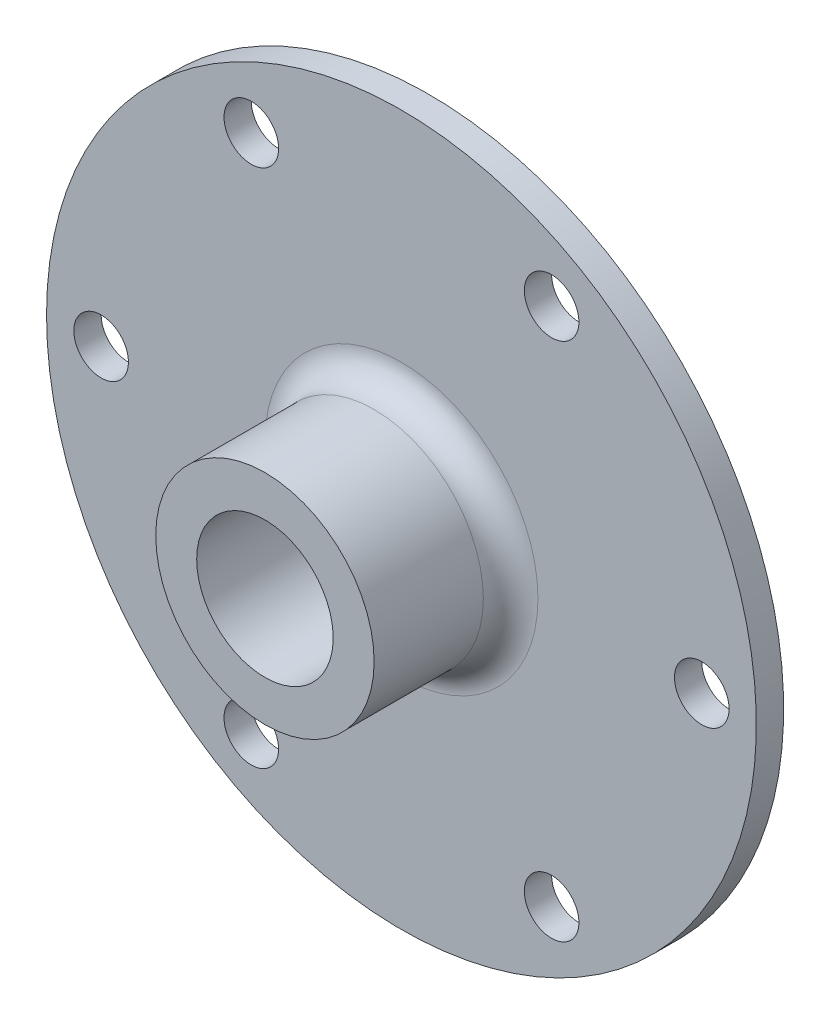
ISO-10303-21;
HEADER;
FILE_DESCRIPTION(('STEP AP214'),'2;1');
FILE_NAME('part.step','',(''),(''),'','','');
FILE_SCHEMA(('AUTOMOTIVE_DESIGN { 1 0 10303 214 1 1 1 1 }'));
ENDSEC;
DATA;
#1=APPLICATION_CONTEXT('core data for automotive mechanical design processes');
#2=APPLICATION_PROTOCOL_DEFINITION('international standard','automotive_design',2000,#1);
#3=PRODUCT_CONTEXT('',#1,'mechanical');
#4=PRODUCT('Part','Part','',(#3));
#5=PRODUCT_RELATED_PRODUCT_CATEGORY('part','',(#4));
#6=PRODUCT_DEFINITION_FORMATION('','',#4);
#7=PRODUCT_DEFINITION_CONTEXT('part definition',#1,'design');
#8=PRODUCT_DEFINITION('design','',#6,#7);
#9=PRODUCT_DEFINITION_SHAPE('','',#8);
#10=(LENGTH_UNIT() NAMED_UNIT(*) SI_UNIT(.MILLI.,.METRE.));
#11=(NAMED_UNIT(*) PLANE_ANGLE_UNIT() SI_UNIT($,.RADIAN.));
#12=(NAMED_UNIT(*) SI_UNIT($,.STERADIAN.) SOLID_ANGLE_UNIT());
#13=UNCERTAINTY_MEASURE_WITH_UNIT(LENGTH_MEASURE(1.E-05),#10,'distance_accuracy_value','');
#14=(GEOMETRIC_REPRESENTATION_CONTEXT(3) GLOBAL_UNCERTAINTY_ASSIGNED_CONTEXT((#13)) GLOBAL_UNIT_ASSIGNED_CONTEXT((#10,
#11,#12)) REPRESENTATION_CONTEXT('',''));
#15=CARTESIAN_POINT('',(0.,0.,0.));
#16=DIRECTION('',(0.,0.,1.));
#17=DIRECTION('',(1.,0.,0.));
#18=AXIS2_PLACEMENT_3D('',#15,#16,#17);
#19=CARTESIAN_POINT('',(0.,0.,1.92363442006733));
#20=DIRECTION('',(0.,0.,-1.));
#21=DIRECTION('',(-1.,0.,0.));
#22=AXIS2_PLACEMENT_3D('',#19,#20,#21);
#23=CYLINDRICAL_SURFACE('',#22,20.6375);
#24=CARTESIAN_POINT('',(0.,0.,3.51113442006734));
#25=DIRECTION('',(0.,0.,-1.));
#26=DIRECTION('',(-1.,0.,0.));
#27=AXIS2_PLACEMENT_3D('',#24,#25,#26);
#28=CIRCLE('',#27,20.6375);
#29=CARTESIAN_POINT('',(-20.6375,0.,3.51113442006734));
#30=VERTEX_POINT('',#29);
#31=EDGE_CURVE('E53',#30,#30,#28,.T.);
#32=ORIENTED_EDGE('',*,*,#31,.T.);
#33=EDGE_LOOP('',(#32));
#34=FACE_BOUND('',#33,.T.);
#35=CARTESIAN_POINT('',(0.,0.,1.92363442006733));
#36=DIRECTION('',(0.,0.,-1.));
#37=DIRECTION('',(-1.,0.,0.));
#38=AXIS2_PLACEMENT_3D('',#35,#36,#37);
#39=CIRCLE('',#38,20.6375);
#40=CARTESIAN_POINT('',(-20.6375,0.,1.92363442006733));
#41=VERTEX_POINT('',#40);
#42=EDGE_CURVE('E72',#41,#41,#39,.T.);
#43=ORIENTED_EDGE('',*,*,#42,.F.);
#44=EDGE_LOOP('',(#43));
#45=FACE_BOUND('',#44,.T.);
#46=ADVANCED_FACE('F40',(#34,#45),#23,.T.);
#47=CARTESIAN_POINT('',(0.,20.6375,3.51113442006734));
#48=DIRECTION('',(0.,0.,1.));
#49=DIRECTION('',(1.,0.,0.));
#50=AXIS2_PLACEMENT_3D('',#47,#48,#49);
#51=PLANE('',#50);
#52=CARTESIAN_POINT('',(8.73125000000018,15.1229686135857,3.51113442006734));
#53=DIRECTION('',(0.,0.,1.));
#54=DIRECTION('',(0.50000000000001,0.866025403784433,0.));
#55=AXIS2_PLACEMENT_3D('',#52,#53,#54);
#56=CIRCLE('',#55,1.5875);
#57=CARTESIAN_POINT('',(9.52500000000019,16.4977839420934,3.51113442006734));
#58=VERTEX_POINT('',#57);
#59=EDGE_CURVE('E116',#58,#58,#56,.T.);
#60=ORIENTED_EDGE('',*,*,#59,.F.);
#61=EDGE_LOOP('',(#60));
#62=FACE_BOUND('',#61,.T.);
#63=CARTESIAN_POINT('',(-8.73124999999986,15.1229686135858,3.51113442006734));
#64=DIRECTION('',(0.,0.,1.));
#65=DIRECTION('',(-0.499999999999992,0.866025403784443,0.));
#66=AXIS2_PLACEMENT_3D('',#63,#64,#65);
#67=CIRCLE('',#66,1.5875);
#68=CARTESIAN_POINT('',(-9.52499999999985,16.4977839420936,3.51113442006734));
#69=VERTEX_POINT('',#68);
#70=EDGE_CURVE('E108',#69,#69,#67,.T.);
#71=ORIENTED_EDGE('',*,*,#70,.F.);
#72=EDGE_LOOP('',(#71));
#73=FACE_BOUND('',#72,.T.);
#74=CARTESIAN_POINT('',(-17.4625,0.,3.51113442006734));
#75=DIRECTION('',(0.,0.,1.));
#76=DIRECTION('',(-1.,0.,0.));
#77=AXIS2_PLACEMENT_3D('',#74,#75,#76);
#78=CIRCLE('',#77,1.5875);
#79=CARTESIAN_POINT('',(-19.05,0.,3.51113442006734));
#80=VERTEX_POINT('',#79);
#81=EDGE_CURVE('E100',#80,#80,#78,.T.);
#82=ORIENTED_EDGE('',*,*,#81,.F.);
#83=EDGE_LOOP('',(#82));
#84=FACE_BOUND('',#83,.T.);
#85=CARTESIAN_POINT('',(-8.73125000000007,-15.1229686135857,3.51113442006734));
#86=DIRECTION('',(0.,0.,1.));
#87=DIRECTION('',(-0.500000000000004,-0.866025403784436,0.));
#88=AXIS2_PLACEMENT_3D('',#85,#86,#87);
#89=CIRCLE('',#88,1.5875);
#90=CARTESIAN_POINT('',(-9.52500000000008,-16.4977839420935,3.51113442006734));
#91=VERTEX_POINT('',#90);
#92=EDGE_CURVE('E92',#91,#91,#89,.T.);
#93=ORIENTED_EDGE('',*,*,#92,.F.);
#94=EDGE_LOOP('',(#93));
#95=FACE_BOUND('',#94,.T.);
#96=CARTESIAN_POINT('',(8.73124999999997,-15.1229686135858,3.51113442006734));
#97=DIRECTION('',(0.,0.,1.));
#98=DIRECTION('',(0.499999999999998,-0.86602540378444,0.));
#99=AXIS2_PLACEMENT_3D('',#96,#97,#98);
#100=CIRCLE('',#99,1.5875);
#101=CARTESIAN_POINT('',(9.52499999999996,-16.4977839420936,3.51113442006734));
#102=VERTEX_POINT('',#101);
#103=EDGE_CURVE('E81',#102,#102,#100,.T.);
#104=ORIENTED_EDGE('',*,*,#103,.F.);
#105=EDGE_LOOP('',(#104));
#106=FACE_BOUND('',#105,.T.);
#107=CARTESIAN_POINT('',(17.4625,0.,3.51113442006734));
#108=DIRECTION('',(0.,0.,1.));
#109=DIRECTION('',(1.,0.,0.));
#110=AXIS2_PLACEMENT_3D('',#107,#108,#109);
#111=CIRCLE('',#110,1.5875);
#112=CARTESIAN_POINT('',(19.05,0.,3.51113442006734));
#113=VERTEX_POINT('',#112);
#114=EDGE_CURVE('E77',#113,#113,#111,.T.);
#115=ORIENTED_EDGE('',*,*,#114,.F.);
#116=EDGE_LOOP('',(#115));
#117=FACE_BOUND('',#116,.T.);
#118=CARTESIAN_POINT('',(0.,0.,3.51113442006734));
#119=DIRECTION('',(0.,0.,1.));
#120=DIRECTION('',(1.,0.,0.));
#121=AXIS2_PLACEMENT_3D('',#118,#119,#120);
#122=CIRCLE('',#121,7.9375);
#123=CARTESIAN_POINT('',(7.9375,0.,3.51113442006734));
#124=VERTEX_POINT('',#123);
#125=EDGE_CURVE('E48',#124,#124,#122,.F.);
#126=ORIENTED_EDGE('',*,*,#125,.T.);
#127=EDGE_LOOP('',(#126));
#128=FACE_BOUND('',#127,.T.);
#129=ORIENTED_EDGE('',*,*,#31,.F.);
#130=EDGE_LOOP('',(#129));
#131=FACE_BOUND('',#130,.T.);
#132=ADVANCED_FACE('F135',(#62,#73,#84,#95,#106,#117,#128,#131),#51,.T.);
#133=CARTESIAN_POINT('',(0.,0.,1.92363442006733));
#134=DIRECTION('',(0.,0.,-1.));
#135=DIRECTION('',(-1.,0.,0.));
#136=AXIS2_PLACEMENT_3D('',#133,#134,#135);
#137=CYLINDRICAL_SURFACE('',#136,6.35);
#138=CARTESIAN_POINT('',(0.,0.,5.09863442006734));
#139=DIRECTION('',(0.,0.,1.));
#140=DIRECTION('',(1.,0.,0.));
#141=AXIS2_PLACEMENT_3D('',#138,#139,#140);
#142=CIRCLE('',#141,6.35);
#143=CARTESIAN_POINT('',(6.35,0.,5.09863442006734));
#144=VERTEX_POINT('',#143);
#145=EDGE_CURVE('E10',#144,#144,#142,.T.);
#146=ORIENTED_EDGE('',*,*,#145,.T.);
#147=EDGE_LOOP('',(#146));
#148=FACE_BOUND('',#147,.T.);
#149=CARTESIAN_POINT('',(0.,0.,11.4486344200673));
#150=DIRECTION('',(0.,0.,-1.));
#151=DIRECTION('',(-1.,0.,0.));
#152=AXIS2_PLACEMENT_3D('',#149,#150,#151);
#153=CIRCLE('',#152,6.35);
#154=CARTESIAN_POINT('',(-6.35,0.,11.4486344200673));
#155=VERTEX_POINT('',#154);
#156=EDGE_CURVE('E58',#155,#155,#153,.T.);
#157=ORIENTED_EDGE('',*,*,#156,.T.);
#158=EDGE_LOOP('',(#157));
#159=FACE_BOUND('',#158,.T.);
#160=ADVANCED_FACE('F138',(#148,#159),#137,.T.);
#161=CARTESIAN_POINT('',(0.,6.35,11.4486344200673));
#162=DIRECTION('',(0.,0.,1.));
#163=DIRECTION('',(1.,0.,0.));
#164=AXIS2_PLACEMENT_3D('',#161,#162,#163);
#165=PLANE('',#164);
#166=CARTESIAN_POINT('',(0.,0.,11.4486344200673));
#167=DIRECTION('',(0.,0.,-1.));
#168=DIRECTION('',(-1.,0.,0.));
#169=AXIS2_PLACEMENT_3D('',#166,#167,#168);
#170=CIRCLE('',#169,3.96875);
#171=CARTESIAN_POINT('',(-3.96875,0.,11.4486344200673));
#172=VERTEX_POINT('',#171);
#173=EDGE_CURVE('E64',#172,#172,#170,.T.);
#174=ORIENTED_EDGE('',*,*,#173,.T.);
#175=EDGE_LOOP('',(#174));
#176=FACE_BOUND('',#175,.T.);
#177=ORIENTED_EDGE('',*,*,#156,.F.);
#178=EDGE_LOOP('',(#177));
#179=FACE_BOUND('',#178,.T.);
#180=ADVANCED_FACE('F164',(#176,#179),#165,.T.);
#181=CARTESIAN_POINT('',(0.,0.,1.92363442006733));
#182=DIRECTION('',(0.,0.,-1.));
#183=DIRECTION('',(-1.,0.,0.));
#184=AXIS2_PLACEMENT_3D('',#181,#182,#183);
#185=CYLINDRICAL_SURFACE('',#184,3.96875);
#186=CARTESIAN_POINT('',(0.,0.,1.92363442006734));
#187=DIRECTION('',(0.,0.,-1.));
#188=DIRECTION('',(-1.,0.,0.));
#189=AXIS2_PLACEMENT_3D('',#186,#187,#188);
#190=CIRCLE('',#189,3.96875);
#191=CARTESIAN_POINT('',(-3.96875,0.,1.92363442006734));
#192=VERTEX_POINT('',#191);
#193=EDGE_CURVE('E68',#192,#192,#190,.T.);
#194=ORIENTED_EDGE('',*,*,#193,.T.);
#195=EDGE_LOOP('',(#194));
#196=FACE_BOUND('',#195,.T.);
#197=ORIENTED_EDGE('',*,*,#173,.F.);
#198=EDGE_LOOP('',(#197));
#199=FACE_BOUND('',#198,.T.);
#200=ADVANCED_FACE('F158',(#196,#199),#185,.F.);
#201=CARTESIAN_POINT('',(0.,3.96875,1.92363442006734));
#202=DIRECTION('',(0.,0.,-1.));
#203=DIRECTION('',(-1.,0.,0.));
#204=AXIS2_PLACEMENT_3D('',#201,#202,#203);
#205=PLANE('',#204);
#206=CARTESIAN_POINT('',(8.73125000000018,15.1229686135857,1.92363442006733));
#207=DIRECTION('',(0.,0.,1.));
#208=DIRECTION('',(0.50000000000001,0.866025403784433,0.));
#209=AXIS2_PLACEMENT_3D('',#206,#207,#208);
#210=CIRCLE('',#209,1.5875);
#211=CARTESIAN_POINT('',(9.52500000000019,16.4977839420934,1.92363442006733));
#212=VERTEX_POINT('',#211);
#213=EDGE_CURVE('E120',#212,#212,#210,.T.);
#214=ORIENTED_EDGE('',*,*,#213,.T.);
#215=EDGE_LOOP('',(#214));
#216=FACE_BOUND('',#215,.T.);
#217=CARTESIAN_POINT('',(-8.73124999999986,15.1229686135858,1.92363442006733));
#218=DIRECTION('',(0.,0.,1.));
#219=DIRECTION('',(-0.499999999999992,0.866025403784443,0.));
#220=AXIS2_PLACEMENT_3D('',#217,#218,#219);
#221=CIRCLE('',#220,1.5875);
#222=CARTESIAN_POINT('',(-9.52499999999985,16.4977839420936,1.92363442006733));
#223=VERTEX_POINT('',#222);
#224=EDGE_CURVE('E112',#223,#223,#221,.T.);
#225=ORIENTED_EDGE('',*,*,#224,.T.);
#226=EDGE_LOOP('',(#225));
#227=FACE_BOUND('',#226,.T.);
#228=CARTESIAN_POINT('',(-17.4625,0.,1.92363442006733));
#229=DIRECTION('',(0.,0.,1.));
#230=DIRECTION('',(-1.,0.,0.));
#231=AXIS2_PLACEMENT_3D('',#228,#229,#230);
#232=CIRCLE('',#231,1.5875);
#233=CARTESIAN_POINT('',(-19.05,0.,1.92363442006733));
#234=VERTEX_POINT('',#233);
#235=EDGE_CURVE('E104',#234,#234,#232,.T.);
#236=ORIENTED_EDGE('',*,*,#235,.T.);
#237=EDGE_LOOP('',(#236));
#238=FACE_BOUND('',#237,.T.);
#239=CARTESIAN_POINT('',(-8.73125000000007,-15.1229686135857,1.92363442006733));
#240=DIRECTION('',(0.,0.,1.));
#241=DIRECTION('',(-0.500000000000004,-0.866025403784436,0.));
#242=AXIS2_PLACEMENT_3D('',#239,#240,#241);
#243=CIRCLE('',#242,1.5875);
#244=CARTESIAN_POINT('',(-9.52500000000008,-16.4977839420935,1.92363442006733));
#245=VERTEX_POINT('',#244);
#246=EDGE_CURVE('E96',#245,#245,#243,.T.);
#247=ORIENTED_EDGE('',*,*,#246,.T.);
#248=EDGE_LOOP('',(#247));
#249=FACE_BOUND('',#248,.T.);
#250=CARTESIAN_POINT('',(8.73124999999997,-15.1229686135858,1.92363442006733));
#251=DIRECTION('',(0.,0.,1.));
#252=DIRECTION('',(0.499999999999998,-0.86602540378444,0.));
#253=AXIS2_PLACEMENT_3D('',#250,#251,#252);
#254=CIRCLE('',#253,1.5875);
#255=CARTESIAN_POINT('',(9.52499999999996,-16.4977839420936,1.92363442006733));
#256=VERTEX_POINT('',#255);
#257=EDGE_CURVE('E88',#256,#256,#254,.T.);
#258=ORIENTED_EDGE('',*,*,#257,.T.);
#259=EDGE_LOOP('',(#258));
#260=FACE_BOUND('',#259,.T.);
#261=CARTESIAN_POINT('',(17.4625,0.,1.92363442006733));
#262=DIRECTION('',(0.,0.,1.));
#263=DIRECTION('',(1.,0.,0.));
#264=AXIS2_PLACEMENT_3D('',#261,#262,#263);
#265=CIRCLE('',#264,1.5875);
#266=CARTESIAN_POINT('',(19.05,0.,1.92363442006733));
#267=VERTEX_POINT('',#266);
#268=EDGE_CURVE('E76',#267,#267,#265,.T.);
#269=ORIENTED_EDGE('',*,*,#268,.T.);
#270=EDGE_LOOP('',(#269));
#271=FACE_BOUND('',#270,.T.);
#272=ORIENTED_EDGE('',*,*,#42,.T.);
#273=EDGE_LOOP('',(#272));
#274=FACE_BOUND('',#273,.T.);
#275=ORIENTED_EDGE('',*,*,#193,.F.);
#276=EDGE_LOOP('',(#275));
#277=FACE_BOUND('',#276,.T.);
#278=ADVANCED_FACE('F125',(#216,#227,#238,#249,#260,#271,#274,#277),#205,.T.);
#279=CARTESIAN_POINT('',(0.,0.,5.09863442006734));
#280=DIRECTION('',(0.,0.,1.));
#281=DIRECTION('',(1.,0.,0.));
#282=AXIS2_PLACEMENT_3D('',#279,#280,#281);
#283=TOROIDAL_SURFACE('',#282,7.9375,1.5875);
#284=ORIENTED_EDGE('',*,*,#145,.F.);
#285=EDGE_LOOP('',(#284));
#286=FACE_BOUND('',#285,.T.);
#287=ORIENTED_EDGE('',*,*,#125,.F.);
#288=EDGE_LOOP('',(#287));
#289=FACE_BOUND('',#288,.T.);
#290=ADVANCED_FACE('F42',(#286,#289),#283,.F.);
#291=CARTESIAN_POINT('',(17.4625,0.,1.92363442006733));
#292=DIRECTION('',(0.,0.,1.));
#293=DIRECTION('',(1.,0.,0.));
#294=AXIS2_PLACEMENT_3D('',#291,#292,#293);
#295=CYLINDRICAL_SURFACE('',#294,1.5875);
#296=ORIENTED_EDGE('',*,*,#268,.F.);
#297=EDGE_LOOP('',(#296));
#298=FACE_BOUND('',#297,.T.);
#299=ORIENTED_EDGE('',*,*,#114,.T.);
#300=EDGE_LOOP('',(#299));
#301=FACE_BOUND('',#300,.T.);
#302=ADVANCED_FACE('F178',(#298,#301),#295,.F.);
#303=CARTESIAN_POINT('',(8.73124999999997,-15.1229686135858,1.92363442006733));
#304=DIRECTION('',(0.,0.,1.));
#305=DIRECTION('',(0.499999999999998,-0.86602540378444,0.));
#306=AXIS2_PLACEMENT_3D('',#303,#304,#305);
#307=CYLINDRICAL_SURFACE('',#306,1.5875);
#308=ORIENTED_EDGE('',*,*,#257,.F.);
#309=EDGE_LOOP('',(#308));
#310=FACE_BOUND('',#309,.T.);
#311=ORIENTED_EDGE('',*,*,#103,.T.);
#312=EDGE_LOOP('',(#311));
#313=FACE_BOUND('',#312,.T.);
#314=ADVANCED_FACE('F181',(#310,#313),#307,.F.);
#315=CARTESIAN_POINT('',(-8.73125000000007,-15.1229686135857,1.92363442006733));
#316=DIRECTION('',(0.,0.,1.));
#317=DIRECTION('',(-0.500000000000004,-0.866025403784436,0.));
#318=AXIS2_PLACEMENT_3D('',#315,#316,#317);
#319=CYLINDRICAL_SURFACE('',#318,1.5875);
#320=ORIENTED_EDGE('',*,*,#246,.F.);
#321=EDGE_LOOP('',(#320));
#322=FACE_BOUND('',#321,.T.);
#323=ORIENTED_EDGE('',*,*,#92,.T.);
#324=EDGE_LOOP('',(#323));
#325=FACE_BOUND('',#324,.T.);
#326=ADVANCED_FACE('F185',(#322,#325),#319,.F.);
#327=CARTESIAN_POINT('',(-17.4625,0.,1.92363442006733));
#328=DIRECTION('',(0.,0.,1.));
#329=DIRECTION('',(-1.,0.,0.));
#330=AXIS2_PLACEMENT_3D('',#327,#328,#329);
#331=CYLINDRICAL_SURFACE('',#330,1.5875);
#332=ORIENTED_EDGE('',*,*,#235,.F.);
#333=EDGE_LOOP('',(#332));
#334=FACE_BOUND('',#333,.T.);
#335=ORIENTED_EDGE('',*,*,#81,.T.);
#336=EDGE_LOOP('',(#335));
#337=FACE_BOUND('',#336,.T.);
#338=ADVANCED_FACE('F189',(#334,#337),#331,.F.);
#339=CARTESIAN_POINT('',(-8.73124999999986,15.1229686135858,1.92363442006733));
#340=DIRECTION('',(0.,0.,1.));
#341=DIRECTION('',(-0.499999999999992,0.866025403784443,0.));
#342=AXIS2_PLACEMENT_3D('',#339,#340,#341);
#343=CYLINDRICAL_SURFACE('',#342,1.5875);
#344=ORIENTED_EDGE('',*,*,#224,.F.);
#345=EDGE_LOOP('',(#344));
#346=FACE_BOUND('',#345,.T.);
#347=ORIENTED_EDGE('',*,*,#70,.T.);
#348=EDGE_LOOP('',(#347));
#349=FACE_BOUND('',#348,.T.);
#350=ADVANCED_FACE('F131',(#346,#349),#343,.F.);
#351=CARTESIAN_POINT('',(8.73125000000018,15.1229686135857,1.92363442006733));
#352=DIRECTION('',(0.,0.,1.));
#353=DIRECTION('',(0.50000000000001,0.866025403784433,0.));
#354=AXIS2_PLACEMENT_3D('',#351,#352,#353);
#355=CYLINDRICAL_SURFACE('',#354,1.5875);
#356=ORIENTED_EDGE('',*,*,#213,.F.);
#357=EDGE_LOOP('',(#356));
#358=FACE_BOUND('',#357,.T.);
#359=ORIENTED_EDGE('',*,*,#59,.T.);
#360=EDGE_LOOP('',(#359));
#361=FACE_BOUND('',#360,.T.);
#362=ADVANCED_FACE('F128',(#358,#361),#355,.F.);
#363=CLOSED_SHELL('',(#46,#132,#160,#180,#200,#278,#290,#302,#314,#326,#338,#350,#362));
#364=MANIFOLD_SOLID_BREP('B2',#363);
#365=ADVANCED_BREP_SHAPE_REPRESENTATION('',(#18,#364),#14);
#366=SHAPE_DEFINITION_REPRESENTATION(#9,#365);
ENDSEC;
END-ISO-10303-21;
